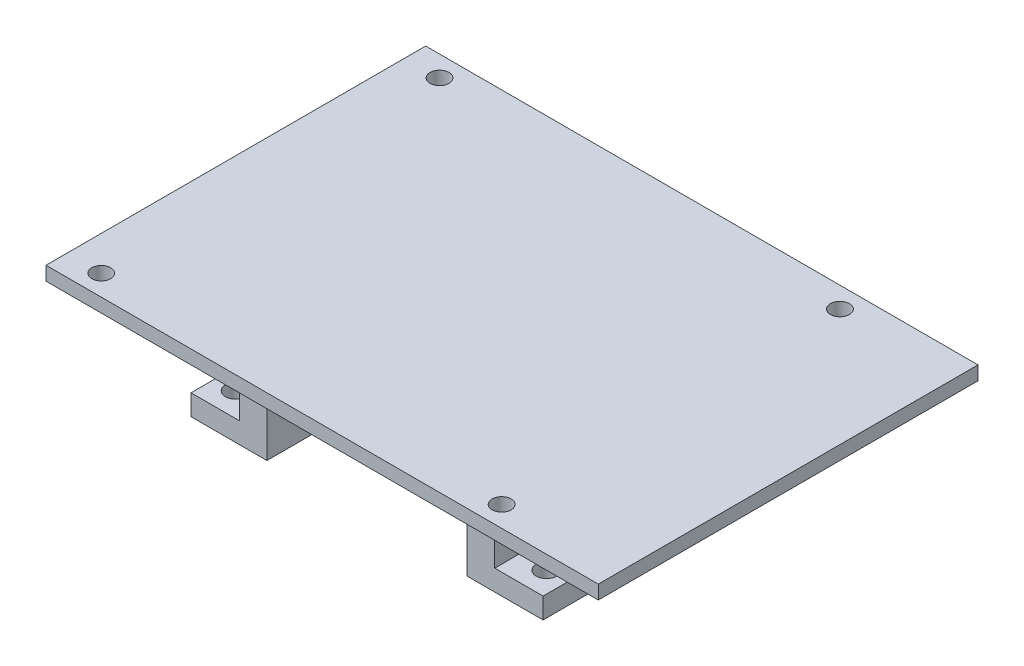
ISO-10303-21;
HEADER;
FILE_DESCRIPTION(('STEP AP214'),'2;1');
FILE_NAME('part.step','',(''),(''),'','','');
FILE_SCHEMA(('AUTOMOTIVE_DESIGN { 1 0 10303 214 1 1 1 1 }'));
ENDSEC;
DATA;
#1=APPLICATION_CONTEXT('core data for automotive mechanical design processes');
#2=APPLICATION_PROTOCOL_DEFINITION('international standard','automotive_design',2000,#1);
#3=PRODUCT_CONTEXT('',#1,'mechanical');
#4=PRODUCT('Part','Part','',(#3));
#5=PRODUCT_RELATED_PRODUCT_CATEGORY('part','',(#4));
#6=PRODUCT_DEFINITION_FORMATION('','',#4);
#7=PRODUCT_DEFINITION_CONTEXT('part definition',#1,'design');
#8=PRODUCT_DEFINITION('design','',#6,#7);
#9=PRODUCT_DEFINITION_SHAPE('','',#8);
#10=(LENGTH_UNIT() NAMED_UNIT(*) SI_UNIT(.MILLI.,.METRE.));
#11=(NAMED_UNIT(*) PLANE_ANGLE_UNIT() SI_UNIT($,.RADIAN.));
#12=(NAMED_UNIT(*) SI_UNIT($,.STERADIAN.) SOLID_ANGLE_UNIT());
#13=UNCERTAINTY_MEASURE_WITH_UNIT(LENGTH_MEASURE(1.E-05),#10,'distance_accuracy_value','');
#14=(GEOMETRIC_REPRESENTATION_CONTEXT(3) GLOBAL_UNCERTAINTY_ASSIGNED_CONTEXT((#13)) GLOBAL_UNIT_ASSIGNED_CONTEXT((#10,
#11,#12)) REPRESENTATION_CONTEXT('',''));
#15=CARTESIAN_POINT('',(0.,0.,0.));
#16=DIRECTION('',(0.,0.,1.));
#17=DIRECTION('',(1.,0.,0.));
#18=AXIS2_PLACEMENT_3D('',#15,#16,#17);
#19=CARTESIAN_POINT('',(-25.5,0.,27.5));
#20=DIRECTION('',(0.,1.,0.));
#21=DIRECTION('',(0.,0.,1.));
#22=AXIS2_PLACEMENT_3D('',#19,#20,#21);
#23=PLANE('',#22);
#24=CARTESIAN_POINT('',(-22.5,0.,17.5));
#25=DIRECTION('',(0.,-1.,0.));
#26=DIRECTION('',(0.,0.,-1.));
#27=AXIS2_PLACEMENT_3D('',#24,#25,#26);
#28=CIRCLE('',#27,1.5);
#29=CARTESIAN_POINT('',(-22.5,0.,16.));
#30=VERTEX_POINT('',#29);
#31=EDGE_CURVE('E485',#30,#30,#28,.T.);
#32=ORIENTED_EDGE('',*,*,#31,.F.);
#33=EDGE_LOOP('',(#32));
#34=FACE_BOUND('',#33,.T.);
#35=DIRECTION('',(0.,0.,-1.));
#36=VECTOR('',#35,1.);
#37=CARTESIAN_POINT('',(-25.5,0.,27.5));
#38=LINE('',#37,#36);
#39=CARTESIAN_POINT('',(-25.5,0.,21.));
#40=VERTEX_POINT('',#39);
#41=CARTESIAN_POINT('',(-25.5,0.,14.));
#42=VERTEX_POINT('',#41);
#43=EDGE_CURVE('E253',#40,#42,#38,.T.);
#44=ORIENTED_EDGE('',*,*,#43,.T.);
#45=DIRECTION('',(-1.,0.,0.));
#46=VECTOR('',#45,1.);
#47=CARTESIAN_POINT('',(25.5,0.,14.));
#48=LINE('',#47,#46);
#49=CARTESIAN_POINT('',(-14.5,0.,14.));
#50=VERTEX_POINT('',#49);
#51=EDGE_CURVE('E350',#50,#42,#48,.T.);
#52=ORIENTED_EDGE('',*,*,#51,.F.);
#53=DIRECTION('',(0.,0.,-1.));
#54=VECTOR('',#53,1.);
#55=CARTESIAN_POINT('',(-14.5,0.,27.5));
#56=LINE('',#55,#54);
#57=CARTESIAN_POINT('',(-14.5,0.,21.));
#58=VERTEX_POINT('',#57);
#59=EDGE_CURVE('E332',#58,#50,#56,.T.);
#60=ORIENTED_EDGE('',*,*,#59,.F.);
#61=DIRECTION('',(1.,0.,0.));
#62=VECTOR('',#61,1.);
#63=CARTESIAN_POINT('',(25.5,0.,21.));
#64=LINE('',#63,#62);
#65=EDGE_CURVE('E348',#40,#58,#64,.T.);
#66=ORIENTED_EDGE('',*,*,#65,.F.);
#67=EDGE_LOOP('',(#44,#52,#60,#66));
#68=FACE_BOUND('',#67,.T.);
#69=ADVANCED_FACE('F39',(#34,#68),#23,.F.);
#70=CARTESIAN_POINT('',(-14.5,0.,27.5));
#71=DIRECTION('',(-1.,0.,0.));
#72=DIRECTION('',(0.,0.,1.));
#73=AXIS2_PLACEMENT_3D('',#70,#71,#72);
#74=PLANE('',#73);
#75=ORIENTED_EDGE('',*,*,#59,.T.);
#76=DIRECTION('',(0.,1.,0.));
#77=VECTOR('',#76,1.);
#78=CARTESIAN_POINT('',(-14.5,0.,14.));
#79=LINE('',#78,#77);
#80=CARTESIAN_POINT('',(-14.5,13.,14.));
#81=VERTEX_POINT('',#80);
#82=EDGE_CURVE('E342',#50,#81,#79,.T.);
#83=ORIENTED_EDGE('',*,*,#82,.T.);
#84=DIRECTION('',(0.,0.,-1.));
#85=VECTOR('',#84,1.);
#86=CARTESIAN_POINT('',(-14.5,13.,27.5));
#87=LINE('',#86,#85);
#88=CARTESIAN_POINT('',(-14.5,13.,21.));
#89=VERTEX_POINT('',#88);
#90=EDGE_CURVE('E329',#89,#81,#87,.T.);
#91=ORIENTED_EDGE('',*,*,#90,.F.);
#92=DIRECTION('',(0.,-1.,0.));
#93=VECTOR('',#92,1.);
#94=CARTESIAN_POINT('',(-14.5,0.,21.));
#95=LINE('',#94,#93);
#96=EDGE_CURVE('E344',#89,#58,#95,.T.);
#97=ORIENTED_EDGE('',*,*,#96,.T.);
#98=EDGE_LOOP('',(#75,#83,#91,#97));
#99=FACE_BOUND('',#98,.T.);
#100=ADVANCED_FACE('F340',(#99),#74,.F.);
#101=CARTESIAN_POINT('',(14.5,13.,27.5));
#102=DIRECTION('',(1.,0.,0.));
#103=DIRECTION('',(0.,0.,-1.));
#104=AXIS2_PLACEMENT_3D('',#101,#102,#103);
#105=PLANE('',#104);
#106=DIRECTION('',(0.,0.,-1.));
#107=VECTOR('',#106,1.);
#108=CARTESIAN_POINT('',(14.5,13.,27.5));
#109=LINE('',#108,#107);
#110=CARTESIAN_POINT('',(14.5,13.,21.));
#111=VERTEX_POINT('',#110);
#112=CARTESIAN_POINT('',(14.5,13.,14.));
#113=VERTEX_POINT('',#112);
#114=EDGE_CURVE('E324',#111,#113,#109,.T.);
#115=ORIENTED_EDGE('',*,*,#114,.T.);
#116=DIRECTION('',(0.,-1.,0.));
#117=VECTOR('',#116,1.);
#118=CARTESIAN_POINT('',(14.5,13.,14.));
#119=LINE('',#118,#117);
#120=CARTESIAN_POINT('',(14.5,0.,14.));
#121=VERTEX_POINT('',#120);
#122=EDGE_CURVE('E448',#113,#121,#119,.T.);
#123=ORIENTED_EDGE('',*,*,#122,.T.);
#124=DIRECTION('',(0.,0.,-1.));
#125=VECTOR('',#124,1.);
#126=CARTESIAN_POINT('',(14.5,0.,27.5));
#127=LINE('',#126,#125);
#128=CARTESIAN_POINT('',(14.5,0.,21.));
#129=VERTEX_POINT('',#128);
#130=EDGE_CURVE('E319',#129,#121,#127,.T.);
#131=ORIENTED_EDGE('',*,*,#130,.F.);
#132=DIRECTION('',(0.,1.,0.));
#133=VECTOR('',#132,1.);
#134=CARTESIAN_POINT('',(14.5,13.,21.));
#135=LINE('',#134,#133);
#136=EDGE_CURVE('E407',#129,#111,#135,.T.);
#137=ORIENTED_EDGE('',*,*,#136,.T.);
#138=EDGE_LOOP('',(#115,#123,#131,#137));
#139=FACE_BOUND('',#138,.T.);
#140=ADVANCED_FACE('F564',(#139),#105,.F.);
#141=CARTESIAN_POINT('',(14.5,0.,27.5));
#142=DIRECTION('',(0.,1.,0.));
#143=DIRECTION('',(0.,0.,1.));
#144=AXIS2_PLACEMENT_3D('',#141,#142,#143);
#145=PLANE('',#144);
#146=CARTESIAN_POINT('',(22.5,0.,17.5));
#147=DIRECTION('',(0.,-1.,0.));
#148=DIRECTION('',(0.,0.,-1.));
#149=AXIS2_PLACEMENT_3D('',#146,#147,#148);
#150=CIRCLE('',#149,1.5);
#151=CARTESIAN_POINT('',(22.5,0.,16.));
#152=VERTEX_POINT('',#151);
#153=EDGE_CURVE('E481',#152,#152,#150,.T.);
#154=ORIENTED_EDGE('',*,*,#153,.F.);
#155=EDGE_LOOP('',(#154));
#156=FACE_BOUND('',#155,.T.);
#157=ORIENTED_EDGE('',*,*,#130,.T.);
#158=CARTESIAN_POINT('',(25.5,0.,14.));
#159=VERTEX_POINT('',#158);
#160=EDGE_CURVE('E353',#159,#121,#48,.T.);
#161=ORIENTED_EDGE('',*,*,#160,.F.);
#162=DIRECTION('',(0.,0.,-1.));
#163=VECTOR('',#162,1.);
#164=CARTESIAN_POINT('',(25.5,0.,27.5));
#165=LINE('',#164,#163);
#166=CARTESIAN_POINT('',(25.5,0.,21.));
#167=VERTEX_POINT('',#166);
#168=EDGE_CURVE('E314',#167,#159,#165,.T.);
#169=ORIENTED_EDGE('',*,*,#168,.F.);
#170=EDGE_CURVE('E384',#129,#167,#64,.T.);
#171=ORIENTED_EDGE('',*,*,#170,.F.);
#172=EDGE_LOOP('',(#157,#161,#169,#171));
#173=FACE_BOUND('',#172,.T.);
#174=ADVANCED_FACE('F749',(#156,#173),#145,.F.);
#175=CARTESIAN_POINT('',(25.5,3.,27.5));
#176=DIRECTION('',(-1.,0.,0.));
#177=DIRECTION('',(0.,0.,1.));
#178=AXIS2_PLACEMENT_3D('',#175,#176,#177);
#179=PLANE('',#178);
#180=ORIENTED_EDGE('',*,*,#168,.T.);
#181=DIRECTION('',(0.,-1.,0.));
#182=VECTOR('',#181,1.);
#183=CARTESIAN_POINT('',(25.5,71.1807528311554,14.));
#184=LINE('',#183,#182);
#185=CARTESIAN_POINT('',(25.5,3.,14.));
#186=VERTEX_POINT('',#185);
#187=EDGE_CURVE('E237',#186,#159,#184,.T.);
#188=ORIENTED_EDGE('',*,*,#187,.F.);
#189=DIRECTION('',(0.,0.,-1.));
#190=VECTOR('',#189,1.);
#191=CARTESIAN_POINT('',(25.5,3.,27.5));
#192=LINE('',#191,#190);
#193=CARTESIAN_POINT('',(25.5,3.,21.));
#194=VERTEX_POINT('',#193);
#195=EDGE_CURVE('E309',#194,#186,#192,.T.);
#196=ORIENTED_EDGE('',*,*,#195,.F.);
#197=DIRECTION('',(0.,-1.,0.));
#198=VECTOR('',#197,1.);
#199=CARTESIAN_POINT('',(25.5,71.1807528311554,21.));
#200=LINE('',#199,#198);
#201=EDGE_CURVE('E354',#194,#167,#200,.T.);
#202=ORIENTED_EDGE('',*,*,#201,.T.);
#203=EDGE_LOOP('',(#180,#188,#196,#202));
#204=FACE_BOUND('',#203,.T.);
#205=ADVANCED_FACE('F745',(#204),#179,.F.);
#206=CARTESIAN_POINT('',(18.5,3.,27.5));
#207=DIRECTION('',(0.,-1.,0.));
#208=DIRECTION('',(0.,0.,-1.));
#209=AXIS2_PLACEMENT_3D('',#206,#207,#208);
#210=PLANE('',#209);
#211=CARTESIAN_POINT('',(22.5,3.,17.5));
#212=DIRECTION('',(0.,-1.,0.));
#213=DIRECTION('',(0.,0.,-1.));
#214=AXIS2_PLACEMENT_3D('',#211,#212,#213);
#215=CIRCLE('',#214,1.5);
#216=CARTESIAN_POINT('',(22.5,3.,16.));
#217=VERTEX_POINT('',#216);
#218=EDGE_CURVE('E476',#217,#217,#215,.F.);
#219=ORIENTED_EDGE('',*,*,#218,.F.);
#220=EDGE_LOOP('',(#219));
#221=FACE_BOUND('',#220,.T.);
#222=ORIENTED_EDGE('',*,*,#195,.T.);
#223=DIRECTION('',(-1.,0.,0.));
#224=VECTOR('',#223,1.);
#225=CARTESIAN_POINT('',(18.5,3.,14.));
#226=LINE('',#225,#224);
#227=CARTESIAN_POINT('',(18.5,3.,14.));
#228=VERTEX_POINT('',#227);
#229=EDGE_CURVE('E444',#186,#228,#226,.T.);
#230=ORIENTED_EDGE('',*,*,#229,.T.);
#231=DIRECTION('',(0.,0.,-1.));
#232=VECTOR('',#231,1.);
#233=CARTESIAN_POINT('',(18.5,3.,27.5));
#234=LINE('',#233,#232);
#235=CARTESIAN_POINT('',(18.5,3.,21.));
#236=VERTEX_POINT('',#235);
#237=EDGE_CURVE('E304',#236,#228,#234,.T.);
#238=ORIENTED_EDGE('',*,*,#237,.F.);
#239=DIRECTION('',(1.,0.,0.));
#240=VECTOR('',#239,1.);
#241=CARTESIAN_POINT('',(18.5,3.,21.));
#242=LINE('',#241,#240);
#243=EDGE_CURVE('E403',#236,#194,#242,.T.);
#244=ORIENTED_EDGE('',*,*,#243,.T.);
#245=EDGE_LOOP('',(#222,#230,#238,#244));
#246=FACE_BOUND('',#245,.T.);
#247=ADVANCED_FACE('F742',(#221,#246),#210,.F.);
#248=CARTESIAN_POINT('',(18.5,13.,27.5));
#249=DIRECTION('',(-1.,0.,0.));
#250=DIRECTION('',(0.,0.,1.));
#251=AXIS2_PLACEMENT_3D('',#248,#249,#250);
#252=PLANE('',#251);
#253=ORIENTED_EDGE('',*,*,#237,.T.);
#254=DIRECTION('',(0.,1.,0.));
#255=VECTOR('',#254,1.);
#256=CARTESIAN_POINT('',(18.5,13.,14.));
#257=LINE('',#256,#255);
#258=CARTESIAN_POINT('',(18.5,13.,14.));
#259=VERTEX_POINT('',#258);
#260=EDGE_CURVE('E440',#228,#259,#257,.T.);
#261=ORIENTED_EDGE('',*,*,#260,.T.);
#262=DIRECTION('',(0.,0.,-1.));
#263=VECTOR('',#262,1.);
#264=CARTESIAN_POINT('',(18.5,13.,27.5));
#265=LINE('',#264,#263);
#266=CARTESIAN_POINT('',(18.5,13.,21.));
#267=VERTEX_POINT('',#266);
#268=EDGE_CURVE('E299',#267,#259,#265,.T.);
#269=ORIENTED_EDGE('',*,*,#268,.F.);
#270=DIRECTION('',(0.,-1.,0.));
#271=VECTOR('',#270,1.);
#272=CARTESIAN_POINT('',(18.5,13.,21.));
#273=LINE('',#272,#271);
#274=EDGE_CURVE('E399',#267,#236,#273,.T.);
#275=ORIENTED_EDGE('',*,*,#274,.T.);
#276=EDGE_LOOP('',(#253,#261,#269,#275));
#277=FACE_BOUND('',#276,.T.);
#278=ADVANCED_FACE('F738',(#277),#252,.F.);
#279=CARTESIAN_POINT('',(-18.5,3.,27.5));
#280=DIRECTION('',(1.,0.,0.));
#281=DIRECTION('',(0.,0.,-1.));
#282=AXIS2_PLACEMENT_3D('',#279,#280,#281);
#283=PLANE('',#282);
#284=DIRECTION('',(0.,0.,-1.));
#285=VECTOR('',#284,1.);
#286=CARTESIAN_POINT('',(-18.5,13.,27.5));
#287=LINE('',#286,#285);
#288=CARTESIAN_POINT('',(-18.5,13.,21.));
#289=VERTEX_POINT('',#288);
#290=CARTESIAN_POINT('',(-18.5,13.,14.));
#291=VERTEX_POINT('',#290);
#292=EDGE_CURVE('E278',#289,#291,#287,.T.);
#293=ORIENTED_EDGE('',*,*,#292,.T.);
#294=DIRECTION('',(0.,-1.,0.));
#295=VECTOR('',#294,1.);
#296=CARTESIAN_POINT('',(-18.5,3.,14.));
#297=LINE('',#296,#295);
#298=CARTESIAN_POINT('',(-18.5,3.,14.));
#299=VERTEX_POINT('',#298);
#300=EDGE_CURVE('E436',#291,#299,#297,.T.);
#301=ORIENTED_EDGE('',*,*,#300,.T.);
#302=DIRECTION('',(0.,0.,-1.));
#303=VECTOR('',#302,1.);
#304=CARTESIAN_POINT('',(-18.5,3.,27.5));
#305=LINE('',#304,#303);
#306=CARTESIAN_POINT('',(-18.5,3.,21.));
#307=VERTEX_POINT('',#306);
#308=EDGE_CURVE('E273',#307,#299,#305,.T.);
#309=ORIENTED_EDGE('',*,*,#308,.F.);
#310=DIRECTION('',(0.,1.,0.));
#311=VECTOR('',#310,1.);
#312=CARTESIAN_POINT('',(-18.5,3.,21.));
#313=LINE('',#312,#311);
#314=EDGE_CURVE('E395',#307,#289,#313,.T.);
#315=ORIENTED_EDGE('',*,*,#314,.T.);
#316=EDGE_LOOP('',(#293,#301,#309,#315));
#317=FACE_BOUND('',#316,.T.);
#318=ADVANCED_FACE('F664',(#317),#283,.F.);
#319=CARTESIAN_POINT('',(-25.5,3.,27.5));
#320=DIRECTION('',(0.,-1.,0.));
#321=DIRECTION('',(0.,0.,-1.));
#322=AXIS2_PLACEMENT_3D('',#319,#320,#321);
#323=PLANE('',#322);
#324=CARTESIAN_POINT('',(-22.5,3.,17.5));
#325=DIRECTION('',(0.,-1.,0.));
#326=DIRECTION('',(0.,0.,-1.));
#327=AXIS2_PLACEMENT_3D('',#324,#325,#326);
#328=CIRCLE('',#327,1.5);
#329=CARTESIAN_POINT('',(-22.5,3.,16.));
#330=VERTEX_POINT('',#329);
#331=EDGE_CURVE('E486',#330,#330,#328,.F.);
#332=ORIENTED_EDGE('',*,*,#331,.F.);
#333=EDGE_LOOP('',(#332));
#334=FACE_BOUND('',#333,.T.);
#335=ORIENTED_EDGE('',*,*,#308,.T.);
#336=DIRECTION('',(-1.,0.,0.));
#337=VECTOR('',#336,1.);
#338=CARTESIAN_POINT('',(-25.5,3.,14.));
#339=LINE('',#338,#337);
#340=CARTESIAN_POINT('',(-25.5,3.,14.));
#341=VERTEX_POINT('',#340);
#342=EDGE_CURVE('E432',#299,#341,#339,.T.);
#343=ORIENTED_EDGE('',*,*,#342,.T.);
#344=DIRECTION('',(0.,0.,-1.));
#345=VECTOR('',#344,1.);
#346=CARTESIAN_POINT('',(-25.5,3.,27.5));
#347=LINE('',#346,#345);
#348=CARTESIAN_POINT('',(-25.5,3.,21.));
#349=VERTEX_POINT('',#348);
#350=EDGE_CURVE('E268',#349,#341,#347,.T.);
#351=ORIENTED_EDGE('',*,*,#350,.F.);
#352=DIRECTION('',(1.,0.,0.));
#353=VECTOR('',#352,1.);
#354=CARTESIAN_POINT('',(-25.5,3.,21.));
#355=LINE('',#354,#353);
#356=EDGE_CURVE('E391',#349,#307,#355,.T.);
#357=ORIENTED_EDGE('',*,*,#356,.T.);
#358=EDGE_LOOP('',(#335,#343,#351,#357));
#359=FACE_BOUND('',#358,.T.);
#360=ADVANCED_FACE('F575',(#334,#359),#323,.F.);
#361=CARTESIAN_POINT('',(-25.5,0.,27.5));
#362=DIRECTION('',(1.,0.,0.));
#363=DIRECTION('',(0.,0.,-1.));
#364=AXIS2_PLACEMENT_3D('',#361,#362,#363);
#365=PLANE('',#364);
#366=ORIENTED_EDGE('',*,*,#350,.T.);
#367=DIRECTION('',(0.,-1.,0.));
#368=VECTOR('',#367,1.);
#369=CARTESIAN_POINT('',(-25.5,0.,14.));
#370=LINE('',#369,#368);
#371=EDGE_CURVE('E11',#341,#42,#370,.T.);
#372=ORIENTED_EDGE('',*,*,#371,.T.);
#373=ORIENTED_EDGE('',*,*,#43,.F.);
#374=DIRECTION('',(0.,-1.,0.));
#375=VECTOR('',#374,1.);
#376=CARTESIAN_POINT('',(-25.5,71.1807528311554,21.));
#377=LINE('',#376,#375);
#378=EDGE_CURVE('E383',#349,#40,#377,.T.);
#379=ORIENTED_EDGE('',*,*,#378,.F.);
#380=EDGE_LOOP('',(#366,#372,#373,#379));
#381=FACE_BOUND('',#380,.T.);
#382=ADVANCED_FACE('F557',(#381),#365,.F.);
#383=CARTESIAN_POINT('',(-22.5,0.,-17.5));
#384=DIRECTION('',(0.,-1.,0.));
#385=DIRECTION('',(0.,0.,-1.));
#386=AXIS2_PLACEMENT_3D('',#383,#384,#385);
#387=CIRCLE('',#386,1.5);
#388=CARTESIAN_POINT('',(-22.5,0.,-19.));
#389=VERTEX_POINT('',#388);
#390=EDGE_CURVE('E490',#389,#389,#387,.T.);
#391=ORIENTED_EDGE('',*,*,#390,.F.);
#392=EDGE_LOOP('',(#391));
#393=FACE_BOUND('',#392,.T.);
#394=CARTESIAN_POINT('',(-25.5,0.,-14.));
#395=VERTEX_POINT('',#394);
#396=CARTESIAN_POINT('',(-25.5,0.,-21.));
#397=VERTEX_POINT('',#396);
#398=EDGE_CURVE('E243',#395,#397,#38,.T.);
#399=ORIENTED_EDGE('',*,*,#398,.T.);
#400=DIRECTION('',(-1.,0.,0.));
#401=VECTOR('',#400,1.);
#402=CARTESIAN_POINT('',(25.5,0.,-21.));
#403=LINE('',#402,#401);
#404=CARTESIAN_POINT('',(-14.5,0.,-21.));
#405=VERTEX_POINT('',#404);
#406=EDGE_CURVE('E224',#405,#397,#403,.T.);
#407=ORIENTED_EDGE('',*,*,#406,.F.);
#408=CARTESIAN_POINT('',(-14.5,0.,-14.));
#409=VERTEX_POINT('',#408);
#410=EDGE_CURVE('E330',#409,#405,#56,.T.);
#411=ORIENTED_EDGE('',*,*,#410,.F.);
#412=DIRECTION('',(1.,0.,0.));
#413=VECTOR('',#412,1.);
#414=CARTESIAN_POINT('',(25.5,0.,-14.));
#415=LINE('',#414,#413);
#416=EDGE_CURVE('E251',#395,#409,#415,.T.);
#417=ORIENTED_EDGE('',*,*,#416,.F.);
#418=EDGE_LOOP('',(#399,#407,#411,#417));
#419=FACE_BOUND('',#418,.T.);
#420=ADVANCED_FACE('F41',(#393,#419),#23,.F.);
#421=ORIENTED_EDGE('',*,*,#410,.T.);
#422=DIRECTION('',(0.,1.,0.));
#423=VECTOR('',#422,1.);
#424=CARTESIAN_POINT('',(-14.5,0.,-21.));
#425=LINE('',#424,#423);
#426=CARTESIAN_POINT('',(-14.5,13.,-21.));
#427=VERTEX_POINT('',#426);
#428=EDGE_CURVE('E230',#405,#427,#425,.T.);
#429=ORIENTED_EDGE('',*,*,#428,.T.);
#430=CARTESIAN_POINT('',(-14.5,13.,-14.));
#431=VERTEX_POINT('',#430);
#432=EDGE_CURVE('E325',#431,#427,#87,.T.);
#433=ORIENTED_EDGE('',*,*,#432,.F.);
#434=DIRECTION('',(0.,-1.,0.));
#435=VECTOR('',#434,1.);
#436=CARTESIAN_POINT('',(-14.5,0.,-14.));
#437=LINE('',#436,#435);
#438=EDGE_CURVE('E428',#431,#409,#437,.T.);
#439=ORIENTED_EDGE('',*,*,#438,.T.);
#440=EDGE_LOOP('',(#421,#429,#433,#439));
#441=FACE_BOUND('',#440,.T.);
#442=ADVANCED_FACE('F565',(#441),#74,.F.);
#443=CARTESIAN_POINT('',(14.5,13.,-14.));
#444=VERTEX_POINT('',#443);
#445=CARTESIAN_POINT('',(14.5,13.,-21.));
#446=VERTEX_POINT('',#445);
#447=EDGE_CURVE('E320',#444,#446,#109,.T.);
#448=ORIENTED_EDGE('',*,*,#447,.T.);
#449=DIRECTION('',(0.,-1.,0.));
#450=VECTOR('',#449,1.);
#451=CARTESIAN_POINT('',(14.5,13.,-21.));
#452=LINE('',#451,#450);
#453=CARTESIAN_POINT('',(14.5,0.,-21.));
#454=VERTEX_POINT('',#453);
#455=EDGE_CURVE('E469',#446,#454,#452,.T.);
#456=ORIENTED_EDGE('',*,*,#455,.T.);
#457=CARTESIAN_POINT('',(14.5,0.,-14.));
#458=VERTEX_POINT('',#457);
#459=EDGE_CURVE('E315',#458,#454,#127,.T.);
#460=ORIENTED_EDGE('',*,*,#459,.F.);
#461=DIRECTION('',(0.,1.,0.));
#462=VECTOR('',#461,1.);
#463=CARTESIAN_POINT('',(14.5,13.,-14.));
#464=LINE('',#463,#462);
#465=EDGE_CURVE('E424',#458,#444,#464,.T.);
#466=ORIENTED_EDGE('',*,*,#465,.T.);
#467=EDGE_LOOP('',(#448,#456,#460,#466));
#468=FACE_BOUND('',#467,.T.);
#469=ADVANCED_FACE('F573',(#468),#105,.F.);
#470=CARTESIAN_POINT('',(22.5,0.,-17.5));
#471=DIRECTION('',(0.,-1.,0.));
#472=DIRECTION('',(0.,0.,-1.));
#473=AXIS2_PLACEMENT_3D('',#470,#471,#472);
#474=CIRCLE('',#473,1.5);
#475=CARTESIAN_POINT('',(22.5,0.,-19.));
#476=VERTEX_POINT('',#475);
#477=EDGE_CURVE('E480',#476,#476,#474,.T.);
#478=ORIENTED_EDGE('',*,*,#477,.F.);
#479=EDGE_LOOP('',(#478));
#480=FACE_BOUND('',#479,.T.);
#481=ORIENTED_EDGE('',*,*,#459,.T.);
#482=CARTESIAN_POINT('',(25.5,0.,-21.));
#483=VERTEX_POINT('',#482);
#484=EDGE_CURVE('E236',#483,#454,#403,.T.);
#485=ORIENTED_EDGE('',*,*,#484,.F.);
#486=CARTESIAN_POINT('',(25.5,0.,-14.));
#487=VERTEX_POINT('',#486);
#488=EDGE_CURVE('E310',#487,#483,#165,.T.);
#489=ORIENTED_EDGE('',*,*,#488,.F.);
#490=EDGE_CURVE('E358',#458,#487,#415,.T.);
#491=ORIENTED_EDGE('',*,*,#490,.F.);
#492=EDGE_LOOP('',(#481,#485,#489,#491));
#493=FACE_BOUND('',#492,.T.);
#494=ADVANCED_FACE('F613',(#480,#493),#145,.F.);
#495=ORIENTED_EDGE('',*,*,#488,.T.);
#496=DIRECTION('',(0.,-1.,0.));
#497=VECTOR('',#496,1.);
#498=CARTESIAN_POINT('',(25.5,71.1807528311554,-21.));
#499=LINE('',#498,#497);
#500=CARTESIAN_POINT('',(25.5,3.,-21.));
#501=VERTEX_POINT('',#500);
#502=EDGE_CURVE('E247',#501,#483,#499,.T.);
#503=ORIENTED_EDGE('',*,*,#502,.F.);
#504=CARTESIAN_POINT('',(25.5,3.,-14.));
#505=VERTEX_POINT('',#504);
#506=EDGE_CURVE('E305',#505,#501,#192,.T.);
#507=ORIENTED_EDGE('',*,*,#506,.F.);
#508=DIRECTION('',(0.,-1.,0.));
#509=VECTOR('',#508,1.);
#510=CARTESIAN_POINT('',(25.5,71.1807528311554,-14.));
#511=LINE('',#510,#509);
#512=EDGE_CURVE('E375',#505,#487,#511,.T.);
#513=ORIENTED_EDGE('',*,*,#512,.T.);
#514=EDGE_LOOP('',(#495,#503,#507,#513));
#515=FACE_BOUND('',#514,.T.);
#516=ADVANCED_FACE('F616',(#515),#179,.F.);
#517=CARTESIAN_POINT('',(22.5,3.,-17.5));
#518=DIRECTION('',(0.,-1.,0.));
#519=DIRECTION('',(0.,0.,-1.));
#520=AXIS2_PLACEMENT_3D('',#517,#518,#519);
#521=CIRCLE('',#520,1.5);
#522=CARTESIAN_POINT('',(22.5,3.,-19.));
#523=VERTEX_POINT('',#522);
#524=EDGE_CURVE('E500',#523,#523,#521,.F.);
#525=ORIENTED_EDGE('',*,*,#524,.F.);
#526=EDGE_LOOP('',(#525));
#527=FACE_BOUND('',#526,.T.);
#528=ORIENTED_EDGE('',*,*,#506,.T.);
#529=DIRECTION('',(-1.,0.,0.));
#530=VECTOR('',#529,1.);
#531=CARTESIAN_POINT('',(18.5,3.,-21.));
#532=LINE('',#531,#530);
#533=CARTESIAN_POINT('',(18.5,3.,-21.));
#534=VERTEX_POINT('',#533);
#535=EDGE_CURVE('E465',#501,#534,#532,.T.);
#536=ORIENTED_EDGE('',*,*,#535,.T.);
#537=CARTESIAN_POINT('',(18.5,3.,-14.));
#538=VERTEX_POINT('',#537);
#539=EDGE_CURVE('E300',#538,#534,#234,.T.);
#540=ORIENTED_EDGE('',*,*,#539,.F.);
#541=DIRECTION('',(1.,0.,0.));
#542=VECTOR('',#541,1.);
#543=CARTESIAN_POINT('',(18.5,3.,-14.));
#544=LINE('',#543,#542);
#545=EDGE_CURVE('E55',#538,#505,#544,.T.);
#546=ORIENTED_EDGE('',*,*,#545,.T.);
#547=EDGE_LOOP('',(#528,#536,#540,#546));
#548=FACE_BOUND('',#547,.T.);
#549=ADVANCED_FACE('F620',(#527,#548),#210,.F.);
#550=ORIENTED_EDGE('',*,*,#539,.T.);
#551=DIRECTION('',(0.,1.,0.));
#552=VECTOR('',#551,1.);
#553=CARTESIAN_POINT('',(18.5,13.,-21.));
#554=LINE('',#553,#552);
#555=CARTESIAN_POINT('',(18.5,13.,-21.));
#556=VERTEX_POINT('',#555);
#557=EDGE_CURVE('E461',#534,#556,#554,.T.);
#558=ORIENTED_EDGE('',*,*,#557,.T.);
#559=CARTESIAN_POINT('',(18.5,13.,-14.));
#560=VERTEX_POINT('',#559);
#561=EDGE_CURVE('E295',#560,#556,#265,.T.);
#562=ORIENTED_EDGE('',*,*,#561,.F.);
#563=DIRECTION('',(0.,-1.,0.));
#564=VECTOR('',#563,1.);
#565=CARTESIAN_POINT('',(18.5,13.,-14.));
#566=LINE('',#565,#564);
#567=EDGE_CURVE('E419',#560,#538,#566,.T.);
#568=ORIENTED_EDGE('',*,*,#567,.T.);
#569=EDGE_LOOP('',(#550,#558,#562,#568));
#570=FACE_BOUND('',#569,.T.);
#571=ADVANCED_FACE('F622',(#570),#252,.F.);
#572=CARTESIAN_POINT('',(40.,15.,27.5));
#573=DIRECTION('',(-1.,0.,0.));
#574=DIRECTION('',(0.,0.,1.));
#575=AXIS2_PLACEMENT_3D('',#572,#573,#574);
#576=PLANE('',#575);
#577=DIRECTION('',(0.,1.,0.));
#578=VECTOR('',#577,1.);
#579=CARTESIAN_POINT('',(40.,15.,-27.5));
#580=LINE('',#579,#578);
#581=CARTESIAN_POINT('',(40.,13.,-27.5));
#582=VERTEX_POINT('',#581);
#583=CARTESIAN_POINT('',(40.,15.,-27.5));
#584=VERTEX_POINT('',#583);
#585=EDGE_CURVE('E504',#582,#584,#580,.T.);
#586=ORIENTED_EDGE('',*,*,#585,.T.);
#587=DIRECTION('',(0.,0.,-1.));
#588=VECTOR('',#587,1.);
#589=CARTESIAN_POINT('',(40.,15.,27.5));
#590=LINE('',#589,#588);
#591=CARTESIAN_POINT('',(40.,15.,27.5));
#592=VERTEX_POINT('',#591);
#593=EDGE_CURVE('E287',#592,#584,#590,.T.);
#594=ORIENTED_EDGE('',*,*,#593,.F.);
#595=DIRECTION('',(0.,1.,0.));
#596=VECTOR('',#595,1.);
#597=CARTESIAN_POINT('',(40.,15.,27.5));
#598=LINE('',#597,#596);
#599=CARTESIAN_POINT('',(40.,13.,27.5));
#600=VERTEX_POINT('',#599);
#601=EDGE_CURVE('E511',#600,#592,#598,.T.);
#602=ORIENTED_EDGE('',*,*,#601,.F.);
#603=DIRECTION('',(0.,0.,-1.));
#604=VECTOR('',#603,1.);
#605=CARTESIAN_POINT('',(40.,13.,27.5));
#606=LINE('',#605,#604);
#607=EDGE_CURVE('E291',#600,#582,#606,.T.);
#608=ORIENTED_EDGE('',*,*,#607,.T.);
#609=EDGE_LOOP('',(#586,#594,#602,#608));
#610=FACE_BOUND('',#609,.T.);
#611=ADVANCED_FACE('F535',(#610),#576,.F.);
#612=CARTESIAN_POINT('',(-40.,15.,27.5));
#613=DIRECTION('',(0.,-1.,0.));
#614=DIRECTION('',(0.,0.,-1.));
#615=AXIS2_PLACEMENT_3D('',#612,#613,#614);
#616=PLANE('',#615);
#617=CARTESIAN_POINT('',(22.9999999999999,15.,-24.5));
#618=DIRECTION('',(0.,1.,0.));
#619=DIRECTION('',(0.,0.,1.));
#620=AXIS2_PLACEMENT_3D('',#617,#618,#619);
#621=CIRCLE('',#620,1.375);
#622=CARTESIAN_POINT('',(22.9999999999999,15.,-23.125));
#623=VERTEX_POINT('',#622);
#624=EDGE_CURVE('E697',#623,#623,#621,.T.);
#625=ORIENTED_EDGE('',*,*,#624,.F.);
#626=EDGE_LOOP('',(#625));
#627=FACE_BOUND('',#626,.T.);
#628=CARTESIAN_POINT('',(22.9999999999999,15.,24.5));
#629=DIRECTION('',(0.,1.,0.));
#630=DIRECTION('',(0.,0.,1.));
#631=AXIS2_PLACEMENT_3D('',#628,#629,#630);
#632=CIRCLE('',#631,1.375);
#633=CARTESIAN_POINT('',(22.9999999999999,15.,25.875));
#634=VERTEX_POINT('',#633);
#635=EDGE_CURVE('E689',#634,#634,#632,.T.);
#636=ORIENTED_EDGE('',*,*,#635,.F.);
#637=EDGE_LOOP('',(#636));
#638=FACE_BOUND('',#637,.T.);
#639=CARTESIAN_POINT('',(-34.9999999999999,15.,24.5));
#640=DIRECTION('',(0.,1.,0.));
#641=DIRECTION('',(0.,0.,1.));
#642=AXIS2_PLACEMENT_3D('',#639,#640,#641);
#643=CIRCLE('',#642,1.375);
#644=CARTESIAN_POINT('',(-34.9999999999999,15.,25.875));
#645=VERTEX_POINT('',#644);
#646=EDGE_CURVE('E681',#645,#645,#643,.T.);
#647=ORIENTED_EDGE('',*,*,#646,.F.);
#648=EDGE_LOOP('',(#647));
#649=FACE_BOUND('',#648,.T.);
#650=CARTESIAN_POINT('',(-34.9999999999999,15.,-24.5));
#651=DIRECTION('',(0.,1.,0.));
#652=DIRECTION('',(0.,0.,1.));
#653=AXIS2_PLACEMENT_3D('',#650,#651,#652);
#654=CIRCLE('',#653,1.375);
#655=CARTESIAN_POINT('',(-34.9999999999999,15.,-23.125));
#656=VERTEX_POINT('',#655);
#657=EDGE_CURVE('E674',#656,#656,#654,.T.);
#658=ORIENTED_EDGE('',*,*,#657,.F.);
#659=EDGE_LOOP('',(#658));
#660=FACE_BOUND('',#659,.T.);
#661=DIRECTION('',(-1.,0.,0.));
#662=VECTOR('',#661,1.);
#663=CARTESIAN_POINT('',(-40.,15.,-27.5));
#664=LINE('',#663,#662);
#665=CARTESIAN_POINT('',(-40.,15.,-27.5));
#666=VERTEX_POINT('',#665);
#667=EDGE_CURVE('E518',#584,#666,#664,.T.);
#668=ORIENTED_EDGE('',*,*,#667,.T.);
#669=DIRECTION('',(0.,0.,-1.));
#670=VECTOR('',#669,1.);
#671=CARTESIAN_POINT('',(-40.,15.,27.5));
#672=LINE('',#671,#670);
#673=CARTESIAN_POINT('',(-40.,15.,27.5));
#674=VERTEX_POINT('',#673);
#675=EDGE_CURVE('E283',#674,#666,#672,.T.);
#676=ORIENTED_EDGE('',*,*,#675,.F.);
#677=DIRECTION('',(-1.,0.,0.));
#678=VECTOR('',#677,1.);
#679=CARTESIAN_POINT('',(-40.,15.,27.5));
#680=LINE('',#679,#678);
#681=EDGE_CURVE('E260',#592,#674,#680,.T.);
#682=ORIENTED_EDGE('',*,*,#681,.F.);
#683=ORIENTED_EDGE('',*,*,#593,.T.);
#684=EDGE_LOOP('',(#668,#676,#682,#683));
#685=FACE_BOUND('',#684,.T.);
#686=ADVANCED_FACE('F541',(#627,#638,#649,#660,#685),#616,.F.);
#687=CARTESIAN_POINT('',(-40.,15.,27.5));
#688=DIRECTION('',(1.,0.,0.));
#689=DIRECTION('',(0.,0.,-1.));
#690=AXIS2_PLACEMENT_3D('',#687,#688,#689);
#691=PLANE('',#690);
#692=DIRECTION('',(0.,-1.,0.));
#693=VECTOR('',#692,1.);
#694=CARTESIAN_POINT('',(-40.,15.,-27.5));
#695=LINE('',#694,#693);
#696=CARTESIAN_POINT('',(-40.,13.,-27.5));
#697=VERTEX_POINT('',#696);
#698=EDGE_CURVE('E520',#666,#697,#695,.T.);
#699=ORIENTED_EDGE('',*,*,#698,.T.);
#700=DIRECTION('',(0.,0.,-1.));
#701=VECTOR('',#700,1.);
#702=CARTESIAN_POINT('',(-40.,13.,27.5));
#703=LINE('',#702,#701);
#704=CARTESIAN_POINT('',(-40.,13.,27.5));
#705=VERTEX_POINT('',#704);
#706=EDGE_CURVE('E279',#705,#697,#703,.T.);
#707=ORIENTED_EDGE('',*,*,#706,.F.);
#708=DIRECTION('',(0.,-1.,0.));
#709=VECTOR('',#708,1.);
#710=CARTESIAN_POINT('',(-40.,15.,27.5));
#711=LINE('',#710,#709);
#712=EDGE_CURVE('E254',#674,#705,#711,.T.);
#713=ORIENTED_EDGE('',*,*,#712,.F.);
#714=ORIENTED_EDGE('',*,*,#675,.T.);
#715=EDGE_LOOP('',(#699,#707,#713,#714));
#716=FACE_BOUND('',#715,.T.);
#717=ADVANCED_FACE('F544',(#716),#691,.F.);
#718=CARTESIAN_POINT('',(-18.5,13.,27.5));
#719=DIRECTION('',(0.,1.,0.));
#720=DIRECTION('',(-1.,0.,0.));
#721=AXIS2_PLACEMENT_3D('',#718,#719,#720);
#722=PLANE('',#721);
#723=CARTESIAN_POINT('',(22.9999999999999,13.,-24.5));
#724=DIRECTION('',(0.,1.,0.));
#725=DIRECTION('',(-1.,0.,0.));
#726=AXIS2_PLACEMENT_3D('',#723,#724,#725);
#727=CIRCLE('',#726,1.375);
#728=CARTESIAN_POINT('',(21.6249999999999,13.,-24.5));
#729=VERTEX_POINT('',#728);
#730=EDGE_CURVE('E693',#729,#729,#727,.F.);
#731=ORIENTED_EDGE('',*,*,#730,.F.);
#732=EDGE_LOOP('',(#731));
#733=FACE_BOUND('',#732,.T.);
#734=CARTESIAN_POINT('',(22.9999999999999,13.,24.5));
#735=DIRECTION('',(0.,1.,0.));
#736=DIRECTION('',(-1.,0.,0.));
#737=AXIS2_PLACEMENT_3D('',#734,#735,#736);
#738=CIRCLE('',#737,1.375);
#739=CARTESIAN_POINT('',(21.6249999999999,13.,24.5));
#740=VERTEX_POINT('',#739);
#741=EDGE_CURVE('E685',#740,#740,#738,.F.);
#742=ORIENTED_EDGE('',*,*,#741,.F.);
#743=EDGE_LOOP('',(#742));
#744=FACE_BOUND('',#743,.T.);
#745=CARTESIAN_POINT('',(-34.9999999999999,13.,24.5));
#746=DIRECTION('',(0.,1.,0.));
#747=DIRECTION('',(-1.,0.,0.));
#748=AXIS2_PLACEMENT_3D('',#745,#746,#747);
#749=CIRCLE('',#748,1.375);
#750=CARTESIAN_POINT('',(-36.3749999999999,13.,24.5));
#751=VERTEX_POINT('',#750);
#752=EDGE_CURVE('E677',#751,#751,#749,.F.);
#753=ORIENTED_EDGE('',*,*,#752,.F.);
#754=EDGE_LOOP('',(#753));
#755=FACE_BOUND('',#754,.T.);
#756=CARTESIAN_POINT('',(-34.9999999999999,13.,-24.5));
#757=DIRECTION('',(0.,1.,0.));
#758=DIRECTION('',(-1.,0.,0.));
#759=AXIS2_PLACEMENT_3D('',#756,#757,#758);
#760=CIRCLE('',#759,1.375);
#761=CARTESIAN_POINT('',(-36.3749999999999,13.,-24.5));
#762=VERTEX_POINT('',#761);
#763=EDGE_CURVE('E671',#762,#762,#760,.F.);
#764=ORIENTED_EDGE('',*,*,#763,.F.);
#765=EDGE_LOOP('',(#764));
#766=FACE_BOUND('',#765,.T.);
#767=DIRECTION('',(1.,0.,0.));
#768=VECTOR('',#767,1.);
#769=CARTESIAN_POINT('',(-18.5,13.,-27.5));
#770=LINE('',#769,#768);
#771=EDGE_CURVE('E264',#697,#582,#770,.T.);
#772=ORIENTED_EDGE('',*,*,#771,.T.);
#773=ORIENTED_EDGE('',*,*,#607,.F.);
#774=DIRECTION('',(1.,0.,0.));
#775=VECTOR('',#774,1.);
#776=CARTESIAN_POINT('',(-14.5,13.,27.5));
#777=LINE('',#776,#775);
#778=EDGE_CURVE('E508',#705,#600,#777,.T.);
#779=ORIENTED_EDGE('',*,*,#778,.F.);
#780=ORIENTED_EDGE('',*,*,#706,.T.);
#781=EDGE_LOOP('',(#772,#773,#779,#780));
#782=FACE_BOUND('',#781,.T.);
#783=DIRECTION('',(1.,0.,0.));
#784=VECTOR('',#783,1.);
#785=CARTESIAN_POINT('',(25.5,13.,-14.));
#786=LINE('',#785,#784);
#787=CARTESIAN_POINT('',(-18.5,13.,-14.));
#788=VERTEX_POINT('',#787);
#789=EDGE_CURVE('E374',#788,#431,#786,.T.);
#790=ORIENTED_EDGE('',*,*,#789,.T.);
#791=ORIENTED_EDGE('',*,*,#432,.T.);
#792=DIRECTION('',(-1.,0.,0.));
#793=VECTOR('',#792,1.);
#794=CARTESIAN_POINT('',(25.5,13.,-21.));
#795=LINE('',#794,#793);
#796=CARTESIAN_POINT('',(-18.5,13.,-21.));
#797=VERTEX_POINT('',#796);
#798=EDGE_CURVE('E594',#427,#797,#795,.T.);
#799=ORIENTED_EDGE('',*,*,#798,.T.);
#800=EDGE_CURVE('E274',#788,#797,#287,.T.);
#801=ORIENTED_EDGE('',*,*,#800,.F.);
#802=EDGE_LOOP('',(#790,#791,#799,#801));
#803=FACE_BOUND('',#802,.T.);
#804=ORIENTED_EDGE('',*,*,#90,.T.);
#805=DIRECTION('',(-1.,0.,0.));
#806=VECTOR('',#805,1.);
#807=CARTESIAN_POINT('',(25.5,13.,14.));
#808=LINE('',#807,#806);
#809=EDGE_CURVE('E365',#81,#291,#808,.T.);
#810=ORIENTED_EDGE('',*,*,#809,.T.);
#811=ORIENTED_EDGE('',*,*,#292,.F.);
#812=DIRECTION('',(1.,0.,0.));
#813=VECTOR('',#812,1.);
#814=CARTESIAN_POINT('',(25.5,13.,21.));
#815=LINE('',#814,#813);
#816=EDGE_CURVE('E360',#289,#89,#815,.T.);
#817=ORIENTED_EDGE('',*,*,#816,.T.);
#818=EDGE_LOOP('',(#804,#810,#811,#817));
#819=FACE_BOUND('',#818,.T.);
#820=EDGE_CURVE('E248',#556,#446,#795,.T.);
#821=ORIENTED_EDGE('',*,*,#820,.T.);
#822=ORIENTED_EDGE('',*,*,#447,.F.);
#823=EDGE_CURVE('E370',#444,#560,#786,.T.);
#824=ORIENTED_EDGE('',*,*,#823,.T.);
#825=ORIENTED_EDGE('',*,*,#561,.T.);
#826=EDGE_LOOP('',(#821,#822,#824,#825));
#827=FACE_BOUND('',#826,.T.);
#828=EDGE_CURVE('E369',#259,#113,#808,.T.);
#829=ORIENTED_EDGE('',*,*,#828,.T.);
#830=ORIENTED_EDGE('',*,*,#114,.F.);
#831=EDGE_CURVE('E385',#111,#267,#815,.T.);
#832=ORIENTED_EDGE('',*,*,#831,.T.);
#833=ORIENTED_EDGE('',*,*,#268,.T.);
#834=EDGE_LOOP('',(#829,#830,#832,#833));
#835=FACE_BOUND('',#834,.T.);
#836=ADVANCED_FACE('F529',(#733,#744,#755,#766,#782,#803,#819,#827,#835),#722,.F.);
#837=ORIENTED_EDGE('',*,*,#800,.T.);
#838=DIRECTION('',(0.,-1.,0.));
#839=VECTOR('',#838,1.);
#840=CARTESIAN_POINT('',(-18.5,3.,-21.));
#841=LINE('',#840,#839);
#842=CARTESIAN_POINT('',(-18.5,3.,-21.));
#843=VERTEX_POINT('',#842);
#844=EDGE_CURVE('E457',#797,#843,#841,.T.);
#845=ORIENTED_EDGE('',*,*,#844,.T.);
#846=CARTESIAN_POINT('',(-18.5,3.,-14.));
#847=VERTEX_POINT('',#846);
#848=EDGE_CURVE('E269',#847,#843,#305,.T.);
#849=ORIENTED_EDGE('',*,*,#848,.F.);
#850=DIRECTION('',(0.,1.,0.));
#851=VECTOR('',#850,1.);
#852=CARTESIAN_POINT('',(-18.5,3.,-14.));
#853=LINE('',#852,#851);
#854=EDGE_CURVE('E415',#847,#788,#853,.T.);
#855=ORIENTED_EDGE('',*,*,#854,.T.);
#856=EDGE_LOOP('',(#837,#845,#849,#855));
#857=FACE_BOUND('',#856,.T.);
#858=ADVANCED_FACE('F588',(#857),#283,.F.);
#859=CARTESIAN_POINT('',(-22.5,3.,-17.5));
#860=DIRECTION('',(0.,-1.,0.));
#861=DIRECTION('',(0.,0.,-1.));
#862=AXIS2_PLACEMENT_3D('',#859,#860,#861);
#863=CIRCLE('',#862,1.5);
#864=CARTESIAN_POINT('',(-22.5,3.,-19.));
#865=VERTEX_POINT('',#864);
#866=EDGE_CURVE('E475',#865,#865,#863,.F.);
#867=ORIENTED_EDGE('',*,*,#866,.F.);
#868=EDGE_LOOP('',(#867));
#869=FACE_BOUND('',#868,.T.);
#870=ORIENTED_EDGE('',*,*,#848,.T.);
#871=DIRECTION('',(-1.,0.,0.));
#872=VECTOR('',#871,1.);
#873=CARTESIAN_POINT('',(-25.5,3.,-21.));
#874=LINE('',#873,#872);
#875=CARTESIAN_POINT('',(-25.5,3.,-21.));
#876=VERTEX_POINT('',#875);
#877=EDGE_CURVE('E454',#843,#876,#874,.T.);
#878=ORIENTED_EDGE('',*,*,#877,.T.);
#879=CARTESIAN_POINT('',(-25.5,3.,-14.));
#880=VERTEX_POINT('',#879);
#881=EDGE_CURVE('E245',#880,#876,#347,.T.);
#882=ORIENTED_EDGE('',*,*,#881,.F.);
#883=DIRECTION('',(1.,0.,0.));
#884=VECTOR('',#883,1.);
#885=CARTESIAN_POINT('',(-25.5,3.,-14.));
#886=LINE('',#885,#884);
#887=EDGE_CURVE('E63',#880,#847,#886,.T.);
#888=ORIENTED_EDGE('',*,*,#887,.T.);
#889=EDGE_LOOP('',(#870,#878,#882,#888));
#890=FACE_BOUND('',#889,.T.);
#891=ADVANCED_FACE('F555',(#869,#890),#323,.F.);
#892=ORIENTED_EDGE('',*,*,#881,.T.);
#893=DIRECTION('',(0.,-1.,0.));
#894=VECTOR('',#893,1.);
#895=CARTESIAN_POINT('',(-25.5,71.1807528311554,-21.));
#896=LINE('',#895,#894);
#897=EDGE_CURVE('E227',#876,#397,#896,.T.);
#898=ORIENTED_EDGE('',*,*,#897,.T.);
#899=ORIENTED_EDGE('',*,*,#398,.F.);
#900=DIRECTION('',(0.,1.,0.));
#901=VECTOR('',#900,1.);
#902=CARTESIAN_POINT('',(-25.5,0.,-14.));
#903=LINE('',#902,#901);
#904=EDGE_CURVE('E48',#395,#880,#903,.T.);
#905=ORIENTED_EDGE('',*,*,#904,.T.);
#906=EDGE_LOOP('',(#892,#898,#899,#905));
#907=FACE_BOUND('',#906,.T.);
#908=ADVANCED_FACE('F242',(#907),#365,.F.);
#909=CARTESIAN_POINT('',(0.,0.,27.5));
#910=DIRECTION('',(0.,0.,1.));
#911=DIRECTION('',(1.,0.,0.));
#912=AXIS2_PLACEMENT_3D('',#909,#910,#911);
#913=PLANE('',#912);
#914=ORIENTED_EDGE('',*,*,#778,.T.);
#915=ORIENTED_EDGE('',*,*,#601,.T.);
#916=ORIENTED_EDGE('',*,*,#681,.T.);
#917=ORIENTED_EDGE('',*,*,#712,.T.);
#918=EDGE_LOOP('',(#914,#915,#916,#917));
#919=FACE_BOUND('',#918,.T.);
#920=ADVANCED_FACE('F546',(#919),#913,.T.);
#921=CARTESIAN_POINT('',(0.,0.,-27.5));
#922=DIRECTION('',(0.,0.,1.));
#923=DIRECTION('',(1.,0.,0.));
#924=AXIS2_PLACEMENT_3D('',#921,#922,#923);
#925=PLANE('',#924);
#926=ORIENTED_EDGE('',*,*,#585,.F.);
#927=ORIENTED_EDGE('',*,*,#771,.F.);
#928=ORIENTED_EDGE('',*,*,#698,.F.);
#929=ORIENTED_EDGE('',*,*,#667,.F.);
#930=EDGE_LOOP('',(#926,#927,#928,#929));
#931=FACE_BOUND('',#930,.T.);
#932=ADVANCED_FACE('F538',(#931),#925,.F.);
#933=CARTESIAN_POINT('',(-22.5,15.001,17.5));
#934=DIRECTION('',(0.,-1.,0.));
#935=DIRECTION('',(0.,0.,-1.));
#936=AXIS2_PLACEMENT_3D('',#933,#934,#935);
#937=CYLINDRICAL_SURFACE('',#936,1.5);
#938=ORIENTED_EDGE('',*,*,#31,.T.);
#939=EDGE_LOOP('',(#938));
#940=FACE_BOUND('',#939,.T.);
#941=ORIENTED_EDGE('',*,*,#331,.T.);
#942=EDGE_LOOP('',(#941));
#943=FACE_BOUND('',#942,.T.);
#944=ADVANCED_FACE('F553',(#940,#943),#937,.F.);
#945=CARTESIAN_POINT('',(-22.5,15.001,-17.5));
#946=DIRECTION('',(0.,-1.,0.));
#947=DIRECTION('',(0.,0.,-1.));
#948=AXIS2_PLACEMENT_3D('',#945,#946,#947);
#949=CYLINDRICAL_SURFACE('',#948,1.5);
#950=ORIENTED_EDGE('',*,*,#390,.T.);
#951=EDGE_LOOP('',(#950));
#952=FACE_BOUND('',#951,.T.);
#953=ORIENTED_EDGE('',*,*,#866,.T.);
#954=EDGE_LOOP('',(#953));
#955=FACE_BOUND('',#954,.T.);
#956=ADVANCED_FACE('F579',(#952,#955),#949,.F.);
#957=CARTESIAN_POINT('',(22.5,15.001,-17.5));
#958=DIRECTION('',(0.,-1.,0.));
#959=DIRECTION('',(0.,0.,-1.));
#960=AXIS2_PLACEMENT_3D('',#957,#958,#959);
#961=CYLINDRICAL_SURFACE('',#960,1.5);
#962=ORIENTED_EDGE('',*,*,#477,.T.);
#963=EDGE_LOOP('',(#962));
#964=FACE_BOUND('',#963,.T.);
#965=ORIENTED_EDGE('',*,*,#524,.T.);
#966=EDGE_LOOP('',(#965));
#967=FACE_BOUND('',#966,.T.);
#968=ADVANCED_FACE('F582',(#964,#967),#961,.F.);
#969=CARTESIAN_POINT('',(22.5,15.001,17.5));
#970=DIRECTION('',(0.,-1.,0.));
#971=DIRECTION('',(0.,0.,-1.));
#972=AXIS2_PLACEMENT_3D('',#969,#970,#971);
#973=CYLINDRICAL_SURFACE('',#972,1.5);
#974=ORIENTED_EDGE('',*,*,#153,.T.);
#975=EDGE_LOOP('',(#974));
#976=FACE_BOUND('',#975,.T.);
#977=ORIENTED_EDGE('',*,*,#218,.T.);
#978=EDGE_LOOP('',(#977));
#979=FACE_BOUND('',#978,.T.);
#980=ADVANCED_FACE('F787',(#976,#979),#973,.F.);
#981=CARTESIAN_POINT('',(25.5,71.1807528311554,-21.));
#982=DIRECTION('',(0.,0.,1.));
#983=DIRECTION('',(1.,0.,0.));
#984=AXIS2_PLACEMENT_3D('',#981,#982,#983);
#985=PLANE('',#984);
#986=ORIENTED_EDGE('',*,*,#406,.T.);
#987=ORIENTED_EDGE('',*,*,#897,.F.);
#988=ORIENTED_EDGE('',*,*,#877,.F.);
#989=ORIENTED_EDGE('',*,*,#844,.F.);
#990=ORIENTED_EDGE('',*,*,#798,.F.);
#991=ORIENTED_EDGE('',*,*,#428,.F.);
#992=EDGE_LOOP('',(#986,#987,#988,#989,#990,#991));
#993=FACE_BOUND('',#992,.T.);
#994=ADVANCED_FACE('F226',(#993),#985,.F.);
#995=ORIENTED_EDGE('',*,*,#820,.F.);
#996=ORIENTED_EDGE('',*,*,#557,.F.);
#997=ORIENTED_EDGE('',*,*,#535,.F.);
#998=ORIENTED_EDGE('',*,*,#502,.T.);
#999=ORIENTED_EDGE('',*,*,#484,.T.);
#1000=ORIENTED_EDGE('',*,*,#455,.F.);
#1001=EDGE_LOOP('',(#995,#996,#997,#998,#999,#1000));
#1002=FACE_BOUND('',#1001,.T.);
#1003=ADVANCED_FACE('F608',(#1002),#985,.F.);
#1004=CARTESIAN_POINT('',(25.5,71.1807528311554,21.));
#1005=DIRECTION('',(0.,0.,-1.));
#1006=DIRECTION('',(-1.,0.,0.));
#1007=AXIS2_PLACEMENT_3D('',#1004,#1005,#1006);
#1008=PLANE('',#1007);
#1009=ORIENTED_EDGE('',*,*,#816,.F.);
#1010=ORIENTED_EDGE('',*,*,#314,.F.);
#1011=ORIENTED_EDGE('',*,*,#356,.F.);
#1012=ORIENTED_EDGE('',*,*,#378,.T.);
#1013=ORIENTED_EDGE('',*,*,#65,.T.);
#1014=ORIENTED_EDGE('',*,*,#96,.F.);
#1015=EDGE_LOOP('',(#1009,#1010,#1011,#1012,#1013,#1014));
#1016=FACE_BOUND('',#1015,.T.);
#1017=ADVANCED_FACE('F784',(#1016),#1008,.F.);
#1018=ORIENTED_EDGE('',*,*,#170,.T.);
#1019=ORIENTED_EDGE('',*,*,#201,.F.);
#1020=ORIENTED_EDGE('',*,*,#243,.F.);
#1021=ORIENTED_EDGE('',*,*,#274,.F.);
#1022=ORIENTED_EDGE('',*,*,#831,.F.);
#1023=ORIENTED_EDGE('',*,*,#136,.F.);
#1024=EDGE_LOOP('',(#1018,#1019,#1020,#1021,#1022,#1023));
#1025=FACE_BOUND('',#1024,.T.);
#1026=ADVANCED_FACE('F768',(#1025),#1008,.F.);
#1027=CARTESIAN_POINT('',(25.5,71.1807528311554,-14.));
#1028=DIRECTION('',(0.,0.,-1.));
#1029=DIRECTION('',(-1.,0.,0.));
#1030=AXIS2_PLACEMENT_3D('',#1027,#1028,#1029);
#1031=PLANE('',#1030);
#1032=ORIENTED_EDGE('',*,*,#789,.F.);
#1033=ORIENTED_EDGE('',*,*,#854,.F.);
#1034=ORIENTED_EDGE('',*,*,#887,.F.);
#1035=ORIENTED_EDGE('',*,*,#904,.F.);
#1036=ORIENTED_EDGE('',*,*,#416,.T.);
#1037=ORIENTED_EDGE('',*,*,#438,.F.);
#1038=EDGE_LOOP('',(#1032,#1033,#1034,#1035,#1036,#1037));
#1039=FACE_BOUND('',#1038,.T.);
#1040=ADVANCED_FACE('F630',(#1039),#1031,.F.);
#1041=CARTESIAN_POINT('',(25.5,71.1807528311554,14.));
#1042=DIRECTION('',(0.,0.,1.));
#1043=DIRECTION('',(1.,0.,0.));
#1044=AXIS2_PLACEMENT_3D('',#1041,#1042,#1043);
#1045=PLANE('',#1044);
#1046=ORIENTED_EDGE('',*,*,#51,.T.);
#1047=ORIENTED_EDGE('',*,*,#371,.F.);
#1048=ORIENTED_EDGE('',*,*,#342,.F.);
#1049=ORIENTED_EDGE('',*,*,#300,.F.);
#1050=ORIENTED_EDGE('',*,*,#809,.F.);
#1051=ORIENTED_EDGE('',*,*,#82,.F.);
#1052=EDGE_LOOP('',(#1046,#1047,#1048,#1049,#1050,#1051));
#1053=FACE_BOUND('',#1052,.T.);
#1054=ADVANCED_FACE('F662',(#1053),#1045,.F.);
#1055=ORIENTED_EDGE('',*,*,#828,.F.);
#1056=ORIENTED_EDGE('',*,*,#260,.F.);
#1057=ORIENTED_EDGE('',*,*,#229,.F.);
#1058=ORIENTED_EDGE('',*,*,#187,.T.);
#1059=ORIENTED_EDGE('',*,*,#160,.T.);
#1060=ORIENTED_EDGE('',*,*,#122,.F.);
#1061=EDGE_LOOP('',(#1055,#1056,#1057,#1058,#1059,#1060));
#1062=FACE_BOUND('',#1061,.T.);
#1063=ADVANCED_FACE('F774',(#1062),#1045,.F.);
#1064=ORIENTED_EDGE('',*,*,#490,.T.);
#1065=ORIENTED_EDGE('',*,*,#512,.F.);
#1066=ORIENTED_EDGE('',*,*,#545,.F.);
#1067=ORIENTED_EDGE('',*,*,#567,.F.);
#1068=ORIENTED_EDGE('',*,*,#823,.F.);
#1069=ORIENTED_EDGE('',*,*,#465,.F.);
#1070=EDGE_LOOP('',(#1064,#1065,#1066,#1067,#1068,#1069));
#1071=FACE_BOUND('',#1070,.T.);
#1072=ADVANCED_FACE('F617',(#1071),#1031,.F.);
#1073=CARTESIAN_POINT('',(-34.9999999999999,-0.000999999999999265,-24.5));
#1074=DIRECTION('',(0.,1.,0.));
#1075=DIRECTION('',(0.,0.,1.));
#1076=AXIS2_PLACEMENT_3D('',#1073,#1074,#1075);
#1077=CYLINDRICAL_SURFACE('',#1076,1.375);
#1078=ORIENTED_EDGE('',*,*,#657,.T.);
#1079=EDGE_LOOP('',(#1078));
#1080=FACE_BOUND('',#1079,.T.);
#1081=ORIENTED_EDGE('',*,*,#763,.T.);
#1082=EDGE_LOOP('',(#1081));
#1083=FACE_BOUND('',#1082,.T.);
#1084=ADVANCED_FACE('F715',(#1080,#1083),#1077,.F.);
#1085=CARTESIAN_POINT('',(-34.9999999999999,-0.000999999999999265,24.5));
#1086=DIRECTION('',(0.,1.,0.));
#1087=DIRECTION('',(0.,0.,1.));
#1088=AXIS2_PLACEMENT_3D('',#1085,#1086,#1087);
#1089=CYLINDRICAL_SURFACE('',#1088,1.375);
#1090=ORIENTED_EDGE('',*,*,#646,.T.);
#1091=EDGE_LOOP('',(#1090));
#1092=FACE_BOUND('',#1091,.T.);
#1093=ORIENTED_EDGE('',*,*,#752,.T.);
#1094=EDGE_LOOP('',(#1093));
#1095=FACE_BOUND('',#1094,.T.);
#1096=ADVANCED_FACE('F718',(#1092,#1095),#1089,.F.);
#1097=CARTESIAN_POINT('',(22.9999999999999,-0.000999999999999265,24.5));
#1098=DIRECTION('',(0.,1.,0.));
#1099=DIRECTION('',(0.,0.,1.));
#1100=AXIS2_PLACEMENT_3D('',#1097,#1098,#1099);
#1101=CYLINDRICAL_SURFACE('',#1100,1.375);
#1102=ORIENTED_EDGE('',*,*,#635,.T.);
#1103=EDGE_LOOP('',(#1102));
#1104=FACE_BOUND('',#1103,.T.);
#1105=ORIENTED_EDGE('',*,*,#741,.T.);
#1106=EDGE_LOOP('',(#1105));
#1107=FACE_BOUND('',#1106,.T.);
#1108=ADVANCED_FACE('F873',(#1104,#1107),#1101,.F.);
#1109=CARTESIAN_POINT('',(22.9999999999999,-0.000999999999999265,-24.5));
#1110=DIRECTION('',(0.,1.,0.));
#1111=DIRECTION('',(0.,0.,1.));
#1112=AXIS2_PLACEMENT_3D('',#1109,#1110,#1111);
#1113=CYLINDRICAL_SURFACE('',#1112,1.375);
#1114=ORIENTED_EDGE('',*,*,#624,.T.);
#1115=EDGE_LOOP('',(#1114));
#1116=FACE_BOUND('',#1115,.T.);
#1117=ORIENTED_EDGE('',*,*,#730,.T.);
#1118=EDGE_LOOP('',(#1117));
#1119=FACE_BOUND('',#1118,.T.);
#1120=ADVANCED_FACE('F703',(#1116,#1119),#1113,.F.);
#1121=CLOSED_SHELL('',(#69,#100,#140,#174,#205,#247,#278,#318,#360,#382,#420,#442,#469,#494,
#516,#549,#571,#611,#686,#717,#836,#858,#891,#908,#920,#932,#944,#956,#968,#980,#994,#1003,
#1017,#1026,#1040,#1054,#1063,#1072,#1084,#1096,#1108,#1120));
#1122=MANIFOLD_SOLID_BREP('B2',#1121);
#1123=ADVANCED_BREP_SHAPE_REPRESENTATION('',(#18,#1122),#14);
#1124=SHAPE_DEFINITION_REPRESENTATION(#9,#1123);
ENDSEC;
END-ISO-10303-21;
